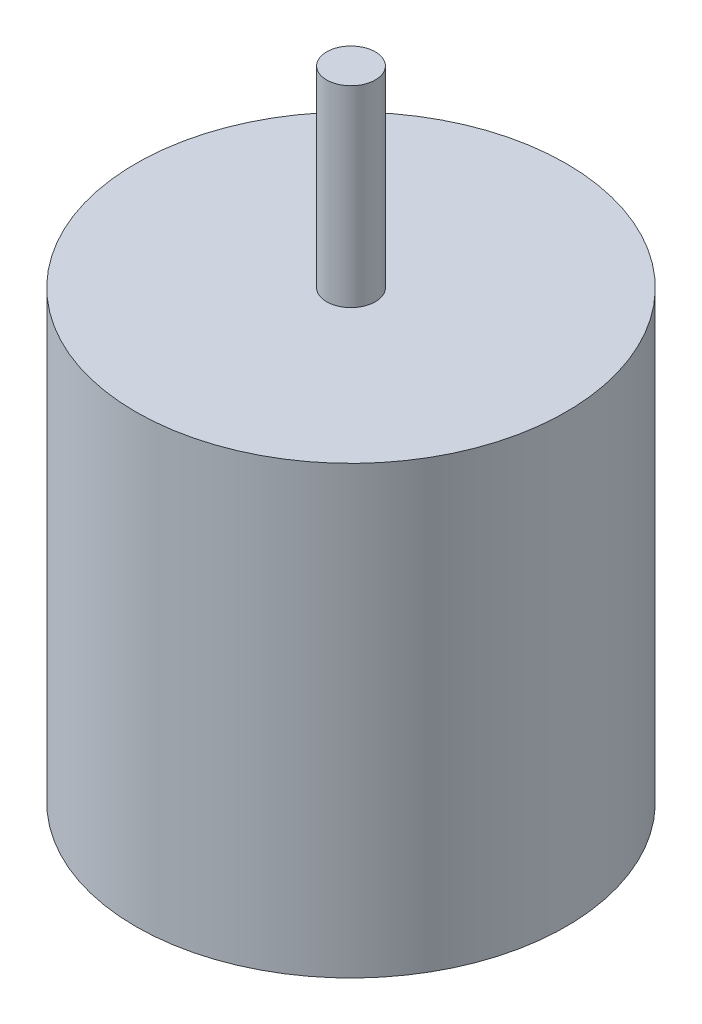
ISO-10303-21;
HEADER;
FILE_DESCRIPTION(('STEP AP214'),'2;1');
FILE_NAME('part.step','',(''),(''),'','','');
FILE_SCHEMA(('AUTOMOTIVE_DESIGN { 1 0 10303 214 1 1 1 1 }'));
ENDSEC;
DATA;
#1=APPLICATION_CONTEXT('core data for automotive mechanical design processes');
#2=APPLICATION_PROTOCOL_DEFINITION('international standard','automotive_design',2000,#1);
#3=PRODUCT_CONTEXT('',#1,'mechanical');
#4=PRODUCT('Part','Part','',(#3));
#5=PRODUCT_RELATED_PRODUCT_CATEGORY('part','',(#4));
#6=PRODUCT_DEFINITION_FORMATION('','',#4);
#7=PRODUCT_DEFINITION_CONTEXT('part definition',#1,'design');
#8=PRODUCT_DEFINITION('design','',#6,#7);
#9=PRODUCT_DEFINITION_SHAPE('','',#8);
#10=(LENGTH_UNIT() NAMED_UNIT(*) SI_UNIT(.MILLI.,.METRE.));
#11=(NAMED_UNIT(*) PLANE_ANGLE_UNIT() SI_UNIT($,.RADIAN.));
#12=(NAMED_UNIT(*) SI_UNIT($,.STERADIAN.) SOLID_ANGLE_UNIT());
#13=UNCERTAINTY_MEASURE_WITH_UNIT(LENGTH_MEASURE(1.E-05),#10,'distance_accuracy_value','');
#14=(GEOMETRIC_REPRESENTATION_CONTEXT(3) GLOBAL_UNCERTAINTY_ASSIGNED_CONTEXT((#13)) GLOBAL_UNIT_ASSIGNED_CONTEXT((#10,
#11,#12)) REPRESENTATION_CONTEXT('',''));
#15=CARTESIAN_POINT('',(0.,0.,0.));
#16=DIRECTION('',(0.,0.,1.));
#17=DIRECTION('',(1.,0.,0.));
#18=AXIS2_PLACEMENT_3D('',#15,#16,#17);
#19=CARTESIAN_POINT('',(0.,29.,0.));
#20=DIRECTION('',(0.,-1.,0.));
#21=DIRECTION('',(0.,0.,-1.));
#22=AXIS2_PLACEMENT_3D('',#19,#20,#21);
#23=CYLINDRICAL_SURFACE('',#22,14.);
#24=CARTESIAN_POINT('',(0.,29.,0.));
#25=DIRECTION('',(0.,1.,0.));
#26=DIRECTION('',(0.,0.,1.));
#27=AXIS2_PLACEMENT_3D('',#24,#25,#26);
#28=CIRCLE('',#27,14.);
#29=CARTESIAN_POINT('',(0.,29.,-14.));
#30=VERTEX_POINT('',#29);
#31=EDGE_CURVE('E10',#30,#30,#28,.T.);
#32=CARTESIAN_POINT('',(0.,0.,0.));
#33=DIRECTION('',(0.,1.,0.));
#34=DIRECTION('',(0.,0.,1.));
#35=AXIS2_PLACEMENT_3D('',#32,#33,#34);
#36=CIRCLE('',#35,14.);
#37=CARTESIAN_POINT('',(0.,0.,-14.));
#38=VERTEX_POINT('',#37);
#39=EDGE_CURVE('E35',#38,#38,#36,.T.);
#40=CARTESIAN_POINT('',(0.,29.,-14.));
#41=CARTESIAN_POINT('',(0.,28.6979166666667,-14.));
#42=CARTESIAN_POINT('',(0.,28.3958333333333,-14.));
#43=CARTESIAN_POINT('',(0.,27.7916666666667,-14.));
#44=CARTESIAN_POINT('',(0.,27.4895833333333,-14.));
#45=CARTESIAN_POINT('',(0.,26.8854166666667,-14.));
#46=CARTESIAN_POINT('',(0.,26.5833333333333,-14.));
#47=CARTESIAN_POINT('',(0.,25.9791666666667,-14.));
#48=CARTESIAN_POINT('',(0.,25.6770833333333,-14.));
#49=CARTESIAN_POINT('',(0.,25.0729166666667,-14.));
#50=CARTESIAN_POINT('',(0.,24.7708333333333,-14.));
#51=CARTESIAN_POINT('',(0.,24.1666666666667,-14.));
#52=CARTESIAN_POINT('',(0.,23.8645833333333,-14.));
#53=CARTESIAN_POINT('',(0.,23.2604166666667,-14.));
#54=CARTESIAN_POINT('',(0.,22.9583333333333,-14.));
#55=CARTESIAN_POINT('',(0.,22.3541666666667,-14.));
#56=CARTESIAN_POINT('',(0.,22.0520833333333,-14.));
#57=CARTESIAN_POINT('',(0.,21.4479166666667,-14.));
#58=CARTESIAN_POINT('',(0.,21.1458333333333,-14.));
#59=CARTESIAN_POINT('',(0.,20.5416666666667,-14.));
#60=CARTESIAN_POINT('',(0.,20.2395833333333,-14.));
#61=CARTESIAN_POINT('',(0.,19.6354166666667,-14.));
#62=CARTESIAN_POINT('',(0.,19.3333333333333,-14.));
#63=CARTESIAN_POINT('',(0.,18.7291666666667,-14.));
#64=CARTESIAN_POINT('',(0.,18.4270833333333,-14.));
#65=CARTESIAN_POINT('',(0.,17.8229166666667,-14.));
#66=CARTESIAN_POINT('',(0.,17.5208333333333,-14.));
#67=CARTESIAN_POINT('',(0.,16.9166666666667,-14.));
#68=CARTESIAN_POINT('',(0.,16.6145833333333,-14.));
#69=CARTESIAN_POINT('',(0.,16.0104166666667,-14.));
#70=CARTESIAN_POINT('',(0.,15.7083333333333,-14.));
#71=CARTESIAN_POINT('',(0.,15.1041666666667,-14.));
#72=CARTESIAN_POINT('',(0.,14.8020833333333,-14.));
#73=CARTESIAN_POINT('',(0.,14.1979166666667,-14.));
#74=CARTESIAN_POINT('',(0.,13.8958333333333,-14.));
#75=CARTESIAN_POINT('',(0.,13.2916666666667,-14.));
#76=CARTESIAN_POINT('',(0.,12.9895833333333,-14.));
#77=CARTESIAN_POINT('',(0.,12.3854166666667,-14.));
#78=CARTESIAN_POINT('',(0.,12.0833333333333,-14.));
#79=CARTESIAN_POINT('',(0.,11.4791666666667,-14.));
#80=CARTESIAN_POINT('',(0.,11.1770833333333,-14.));
#81=CARTESIAN_POINT('',(0.,10.5729166666667,-14.));
#82=CARTESIAN_POINT('',(0.,10.2708333333333,-14.));
#83=CARTESIAN_POINT('',(0.,9.66666666666667,-14.));
#84=CARTESIAN_POINT('',(0.,9.36458333333333,-14.));
#85=CARTESIAN_POINT('',(0.,8.76041666666667,-14.));
#86=CARTESIAN_POINT('',(0.,8.45833333333333,-14.));
#87=CARTESIAN_POINT('',(0.,7.85416666666667,-14.));
#88=CARTESIAN_POINT('',(0.,7.55208333333333,-14.));
#89=CARTESIAN_POINT('',(0.,6.94791666666667,-14.));
#90=CARTESIAN_POINT('',(0.,6.64583333333333,-14.));
#91=CARTESIAN_POINT('',(0.,6.04166666666667,-14.));
#92=CARTESIAN_POINT('',(0.,5.73958333333333,-14.));
#93=CARTESIAN_POINT('',(0.,5.13541666666667,-14.));
#94=CARTESIAN_POINT('',(0.,4.83333333333333,-14.));
#95=CARTESIAN_POINT('',(0.,4.22916666666667,-14.));
#96=CARTESIAN_POINT('',(0.,3.92708333333333,-14.));
#97=CARTESIAN_POINT('',(0.,3.32291666666667,-14.));
#98=CARTESIAN_POINT('',(0.,3.02083333333333,-14.));
#99=CARTESIAN_POINT('',(0.,2.41666666666667,-14.));
#100=CARTESIAN_POINT('',(0.,2.11458333333333,-14.));
#101=CARTESIAN_POINT('',(0.,1.51041666666667,-14.));
#102=CARTESIAN_POINT('',(0.,1.20833333333333,-14.));
#103=CARTESIAN_POINT('',(0.,0.604166666666667,-14.));
#104=CARTESIAN_POINT('',(0.,0.302083333333333,-14.));
#105=CARTESIAN_POINT('',(0.,0.,-14.));
#106=B_SPLINE_CURVE_WITH_KNOTS('',3,(#40,#41,#42,#43,#44,#45,#46,#47,#48,#49,#50,#51,#52,#53,
#54,#55,#56,#57,#58,#59,#60,#61,#62,#63,#64,#65,#66,#67,#68,#69,#70,#71,#72,#73,#74,#75,#76,#77,
#78,#79,#80,#81,#82,#83,#84,#85,#86,#87,#88,#89,#90,#91,#92,#93,#94,#95,#96,#97,#98,#99,#100,
#101,#102,#103,#104,#105),.UNSPECIFIED.,.F.,.F.,(4,2,2,2,2,2,2,2,2,2,2,2,2,2,2,2,2,2,2,2,2,2,2,
2,2,2,2,2,2,2,2,2,4),(0.,0.906250000000001,1.8125,2.71875,3.625,4.53125,5.4375,6.34375,7.25,
8.15625,9.0625,9.96875,10.875,11.78125,12.6875,13.59375,14.5,15.40625,16.3125,17.21875,18.125,
19.03125,19.9375,20.84375,21.75,22.65625,23.5625,24.46875,25.375,26.28125,27.1875,28.09375,29.),.UNSPECIFIED.);
#107=EDGE_CURVE('BSEAM32',#30,#38,#106,.T.);
#108=ORIENTED_EDGE('',*,*,#31,.F.);
#109=ORIENTED_EDGE('',*,*,#39,.T.);
#110=ORIENTED_EDGE('',*,*,#107,.T.);
#111=ORIENTED_EDGE('',*,*,#107,.F.);
#112=EDGE_LOOP('',(#108,#110,#109,#111));
#113=FACE_BOUND('',#112,.T.);
#114=ADVANCED_FACE('F32',(#113),#23,.T.);
#115=CARTESIAN_POINT('',(0.,29.,0.));
#116=DIRECTION('',(0.,1.,0.));
#117=DIRECTION('',(0.,0.,1.));
#118=AXIS2_PLACEMENT_3D('',#115,#116,#117);
#119=PLANE('',#118);
#120=CARTESIAN_POINT('',(0.,29.,0.));
#121=DIRECTION('',(0.,1.,0.));
#122=DIRECTION('',(0.,0.,1.));
#123=AXIS2_PLACEMENT_3D('',#120,#121,#122);
#124=CIRCLE('',#123,1.585);
#125=CARTESIAN_POINT('',(0.,29.,1.585));
#126=VERTEX_POINT('',#125);
#127=EDGE_CURVE('E44',#126,#126,#124,.T.);
#128=ORIENTED_EDGE('',*,*,#127,.F.);
#129=EDGE_LOOP('',(#128));
#130=FACE_BOUND('',#129,.T.);
#131=ORIENTED_EDGE('',*,*,#31,.T.);
#132=EDGE_LOOP('',(#131));
#133=FACE_BOUND('',#132,.T.);
#134=ADVANCED_FACE('F59',(#130,#133),#119,.T.);
#135=CARTESIAN_POINT('',(0.,0.,0.));
#136=DIRECTION('',(0.,1.,0.));
#137=DIRECTION('',(0.,0.,1.));
#138=AXIS2_PLACEMENT_3D('',#135,#136,#137);
#139=PLANE('',#138);
#140=ORIENTED_EDGE('',*,*,#39,.F.);
#141=EDGE_LOOP('',(#140));
#142=FACE_BOUND('',#141,.T.);
#143=ADVANCED_FACE('F55',(#142),#139,.F.);
#144=CARTESIAN_POINT('',(0.,41.5,0.));
#145=DIRECTION('',(0.,-1.,0.));
#146=DIRECTION('',(0.,0.,-1.));
#147=AXIS2_PLACEMENT_3D('',#144,#145,#146);
#148=CYLINDRICAL_SURFACE('',#147,1.585);
#149=CARTESIAN_POINT('',(0.,41.5,0.));
#150=DIRECTION('',(0.,1.,0.));
#151=DIRECTION('',(0.,0.,1.));
#152=AXIS2_PLACEMENT_3D('',#149,#150,#151);
#153=CIRCLE('',#152,1.585);
#154=CARTESIAN_POINT('',(0.,41.5,1.585));
#155=VERTEX_POINT('',#154);
#156=EDGE_CURVE('E42',#155,#155,#153,.T.);
#157=ORIENTED_EDGE('',*,*,#156,.F.);
#158=EDGE_LOOP('',(#157));
#159=FACE_BOUND('',#158,.T.);
#160=ORIENTED_EDGE('',*,*,#127,.T.);
#161=EDGE_LOOP('',(#160));
#162=FACE_BOUND('',#161,.T.);
#163=ADVANCED_FACE('F52',(#159,#162),#148,.T.);
#164=CARTESIAN_POINT('',(0.,41.5,0.));
#165=DIRECTION('',(0.,1.,0.));
#166=DIRECTION('',(0.,0.,1.));
#167=AXIS2_PLACEMENT_3D('',#164,#165,#166);
#168=PLANE('',#167);
#169=ORIENTED_EDGE('',*,*,#156,.T.);
#170=EDGE_LOOP('',(#169));
#171=FACE_BOUND('',#170,.T.);
#172=ADVANCED_FACE('F50',(#171),#168,.T.);
#173=CLOSED_SHELL('',(#114,#134,#143,#163,#172));
#174=MANIFOLD_SOLID_BREP('B2',#173);
#175=ADVANCED_BREP_SHAPE_REPRESENTATION('',(#18,#174),#14);
#176=SHAPE_DEFINITION_REPRESENTATION(#9,#175);
ENDSEC;
END-ISO-10303-21;
